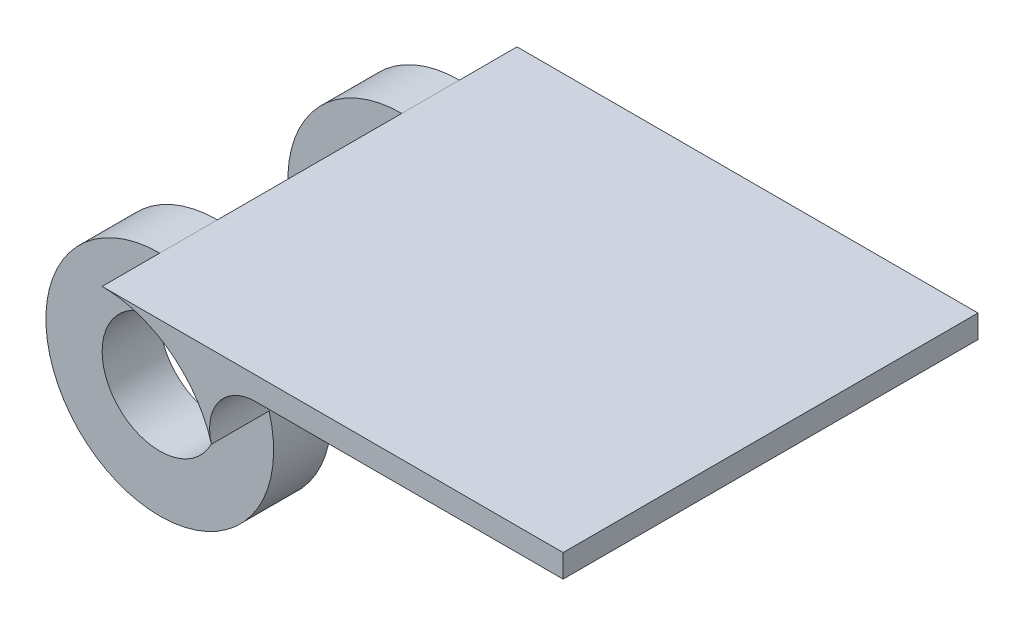
ISO-10303-21;
HEADER;
FILE_DESCRIPTION(('STEP AP214'),'2;1');
FILE_NAME('part.step','',(''),(''),'','','');
FILE_SCHEMA(('AUTOMOTIVE_DESIGN { 1 0 10303 214 1 1 1 1 }'));
ENDSEC;
DATA;
#1=APPLICATION_CONTEXT('core data for automotive mechanical design processes');
#2=APPLICATION_PROTOCOL_DEFINITION('international standard','automotive_design',2000,#1);
#3=PRODUCT_CONTEXT('',#1,'mechanical');
#4=PRODUCT('Part','Part','',(#3));
#5=PRODUCT_RELATED_PRODUCT_CATEGORY('part','',(#4));
#6=PRODUCT_DEFINITION_FORMATION('','',#4);
#7=PRODUCT_DEFINITION_CONTEXT('part definition',#1,'design');
#8=PRODUCT_DEFINITION('design','',#6,#7);
#9=PRODUCT_DEFINITION_SHAPE('','',#8);
#10=(LENGTH_UNIT() NAMED_UNIT(*) SI_UNIT(.MILLI.,.METRE.));
#11=(NAMED_UNIT(*) PLANE_ANGLE_UNIT() SI_UNIT($,.RADIAN.));
#12=(NAMED_UNIT(*) SI_UNIT($,.STERADIAN.) SOLID_ANGLE_UNIT());
#13=UNCERTAINTY_MEASURE_WITH_UNIT(LENGTH_MEASURE(1.E-05),#10,'distance_accuracy_value','');
#14=(GEOMETRIC_REPRESENTATION_CONTEXT(3) GLOBAL_UNCERTAINTY_ASSIGNED_CONTEXT((#13)) GLOBAL_UNIT_ASSIGNED_CONTEXT((#10,
#11,#12)) REPRESENTATION_CONTEXT('',''));
#15=CARTESIAN_POINT('',(0.,0.,0.));
#16=DIRECTION('',(0.,0.,1.));
#17=DIRECTION('',(1.,0.,0.));
#18=AXIS2_PLACEMENT_3D('',#15,#16,#17);
#19=CARTESIAN_POINT('',(0.,0.,22.86));
#20=DIRECTION('',(0.,0.,-1.));
#21=DIRECTION('',(-1.,0.,0.));
#22=AXIS2_PLACEMENT_3D('',#19,#20,#21);
#23=CYLINDRICAL_SURFACE('',#22,6.2738);
#24=CARTESIAN_POINT('',(0.,0.,16.51));
#25=DIRECTION('',(0.,0.,-1.));
#26=DIRECTION('',(-1.,0.,0.));
#27=AXIS2_PLACEMENT_3D('',#24,#25,#26);
#28=CIRCLE('',#27,6.2738);
#29=CARTESIAN_POINT('',(6.02369098499774,1.7537711815562,16.51));
#30=VERTEX_POINT('',#29);
#31=CARTESIAN_POINT('',(0.,6.2738,16.51));
#32=VERTEX_POINT('',#31);
#33=EDGE_CURVE('E124',#30,#32,#28,.T.);
#34=ORIENTED_EDGE('',*,*,#33,.F.);
#35=DIRECTION('',(0.,0.,-1.));
#36=VECTOR('',#35,1.);
#37=CARTESIAN_POINT('',(6.02369098499774,1.7537711815562,22.86));
#38=LINE('',#37,#36);
#39=CARTESIAN_POINT('',(6.02369098499774,1.7537711815562,19.685));
#40=VERTEX_POINT('',#39);
#41=EDGE_CURVE('E58',#30,#40,#38,.F.);
#42=ORIENTED_EDGE('',*,*,#41,.T.);
#43=CARTESIAN_POINT('',(0.,0.,19.685));
#44=DIRECTION('',(0.,0.,1.));
#45=DIRECTION('',(1.,0.,0.));
#46=AXIS2_PLACEMENT_3D('',#43,#44,#45);
#47=CIRCLE('',#46,6.2738);
#48=CARTESIAN_POINT('',(0.,6.2738,19.685));
#49=VERTEX_POINT('',#48);
#50=EDGE_CURVE('E159',#49,#40,#47,.T.);
#51=ORIENTED_EDGE('',*,*,#50,.F.);
#52=DIRECTION('',(0.,0.,1.));
#53=VECTOR('',#52,1.);
#54=CARTESIAN_POINT('',(0.,6.2738,22.86));
#55=LINE('',#54,#53);
#56=EDGE_CURVE('E175',#32,#49,#55,.T.);
#57=ORIENTED_EDGE('',*,*,#56,.F.);
#58=EDGE_LOOP('',(#34,#42,#51,#57));
#59=FACE_BOUND('',#58,.T.);
#60=ADVANCED_FACE('F35',(#59),#23,.T.);
#61=CARTESIAN_POINT('',(0.,0.,22.86));
#62=DIRECTION('',(0.,0.,-1.));
#63=DIRECTION('',(-1.,0.,0.));
#64=AXIS2_PLACEMENT_3D('',#61,#62,#63);
#65=CYLINDRICAL_SURFACE('',#64,3.175);
#66=CARTESIAN_POINT('',(0.,0.,19.685));
#67=DIRECTION('',(0.,0.,1.));
#68=DIRECTION('',(1.,0.,0.));
#69=AXIS2_PLACEMENT_3D('',#66,#67,#68);
#70=CIRCLE('',#69,3.175);
#71=CARTESIAN_POINT('',(3.175,0.,19.685));
#72=VERTEX_POINT('',#71);
#73=EDGE_CURVE('E158',#72,#72,#70,.T.);
#74=ORIENTED_EDGE('',*,*,#73,.T.);
#75=EDGE_LOOP('',(#74));
#76=FACE_BOUND('',#75,.T.);
#77=CARTESIAN_POINT('',(0.,0.,16.51));
#78=DIRECTION('',(0.,0.,-1.));
#79=DIRECTION('',(-1.,0.,0.));
#80=AXIS2_PLACEMENT_3D('',#77,#78,#79);
#81=CIRCLE('',#80,3.175);
#82=CARTESIAN_POINT('',(-3.175,0.,16.51));
#83=VERTEX_POINT('',#82);
#84=EDGE_CURVE('E151',#83,#83,#81,.T.);
#85=ORIENTED_EDGE('',*,*,#84,.T.);
#86=EDGE_LOOP('',(#85));
#87=FACE_BOUND('',#86,.T.);
#88=ADVANCED_FACE('F234',(#76,#87),#65,.F.);
#89=CARTESIAN_POINT('',(8.4624322744705,2.4638,22.86));
#90=DIRECTION('',(0.,0.,-1.));
#91=DIRECTION('',(-1.,0.,0.));
#92=AXIS2_PLACEMENT_3D('',#89,#90,#91);
#93=CYLINDRICAL_SURFACE('',#92,2.54);
#94=CARTESIAN_POINT('',(8.4624322744705,2.4638,16.51));
#95=DIRECTION('',(0.,0.,-1.));
#96=DIRECTION('',(-1.,0.,0.));
#97=AXIS2_PLACEMENT_3D('',#94,#95,#96);
#98=CIRCLE('',#97,2.54);
#99=CARTESIAN_POINT('',(8.4624322744705,5.0038,16.51));
#100=VERTEX_POINT('',#99);
#101=EDGE_CURVE('E11',#100,#30,#98,.F.);
#102=ORIENTED_EDGE('',*,*,#101,.F.);
#103=DIRECTION('',(0.,0.,-1.));
#104=VECTOR('',#103,1.);
#105=CARTESIAN_POINT('',(8.4624322744705,5.0038,0.));
#106=LINE('',#105,#104);
#107=CARTESIAN_POINT('',(8.4624322744705,5.0038,22.86));
#108=VERTEX_POINT('',#107);
#109=EDGE_CURVE('E142',#108,#100,#106,.T.);
#110=ORIENTED_EDGE('',*,*,#109,.F.);
#111=CARTESIAN_POINT('',(8.4624322744705,2.4638,22.86));
#112=DIRECTION('',(0.,0.,1.));
#113=DIRECTION('',(1.,0.,0.));
#114=AXIS2_PLACEMENT_3D('',#111,#112,#113);
#115=CIRCLE('',#114,2.54);
#116=CARTESIAN_POINT('',(6.02369098499773,1.7537711815562,22.86));
#117=VERTEX_POINT('',#116);
#118=EDGE_CURVE('E207',#117,#108,#115,.F.);
#119=ORIENTED_EDGE('',*,*,#118,.F.);
#120=EDGE_CURVE('E200',#40,#117,#38,.F.);
#121=ORIENTED_EDGE('',*,*,#120,.F.);
#122=ORIENTED_EDGE('',*,*,#41,.F.);
#123=EDGE_LOOP('',(#102,#110,#119,#121,#122));
#124=FACE_BOUND('',#123,.T.);
#125=ADVANCED_FACE('F232',(#124),#93,.F.);
#126=CARTESIAN_POINT('',(6.02369098499773,1.7537711815562,3.175));
#127=VERTEX_POINT('',#126);
#128=CARTESIAN_POINT('',(6.02369098499774,1.7537711815562,6.35));
#129=VERTEX_POINT('',#128);
#130=EDGE_CURVE('E205',#127,#129,#38,.F.);
#131=ORIENTED_EDGE('',*,*,#130,.T.);
#132=CARTESIAN_POINT('',(0.,0.,6.35));
#133=DIRECTION('',(0.,0.,-1.));
#134=DIRECTION('',(-1.,0.,0.));
#135=AXIS2_PLACEMENT_3D('',#132,#133,#134);
#136=CIRCLE('',#135,6.2738);
#137=CARTESIAN_POINT('',(0.,6.2738,6.35));
#138=VERTEX_POINT('',#137);
#139=EDGE_CURVE('E50',#129,#138,#136,.T.);
#140=ORIENTED_EDGE('',*,*,#139,.T.);
#141=CARTESIAN_POINT('',(0.,6.2738,3.175));
#142=VERTEX_POINT('',#141);
#143=EDGE_CURVE('E190',#142,#138,#55,.T.);
#144=ORIENTED_EDGE('',*,*,#143,.F.);
#145=CARTESIAN_POINT('',(0.,0.,3.175));
#146=DIRECTION('',(0.,0.,-1.));
#147=DIRECTION('',(-1.,0.,0.));
#148=AXIS2_PLACEMENT_3D('',#145,#146,#147);
#149=CIRCLE('',#148,6.2738);
#150=EDGE_CURVE('E171',#127,#142,#149,.T.);
#151=ORIENTED_EDGE('',*,*,#150,.F.);
#152=EDGE_LOOP('',(#131,#140,#144,#151));
#153=FACE_BOUND('',#152,.T.);
#154=ADVANCED_FACE('F219',(#153),#23,.T.);
#155=CARTESIAN_POINT('',(0.,0.,6.35));
#156=DIRECTION('',(0.,0.,-1.));
#157=DIRECTION('',(-1.,0.,0.));
#158=AXIS2_PLACEMENT_3D('',#155,#156,#157);
#159=CIRCLE('',#158,3.175);
#160=CARTESIAN_POINT('',(-3.175,0.,6.35));
#161=VERTEX_POINT('',#160);
#162=EDGE_CURVE('E148',#161,#161,#159,.T.);
#163=ORIENTED_EDGE('',*,*,#162,.F.);
#164=EDGE_LOOP('',(#163));
#165=FACE_BOUND('',#164,.T.);
#166=CARTESIAN_POINT('',(0.,0.,3.175));
#167=DIRECTION('',(0.,0.,-1.));
#168=DIRECTION('',(-1.,0.,0.));
#169=AXIS2_PLACEMENT_3D('',#166,#167,#168);
#170=CIRCLE('',#169,3.175);
#171=CARTESIAN_POINT('',(-3.175,0.,3.175));
#172=VERTEX_POINT('',#171);
#173=EDGE_CURVE('E170',#172,#172,#170,.T.);
#174=ORIENTED_EDGE('',*,*,#173,.T.);
#175=EDGE_LOOP('',(#174));
#176=FACE_BOUND('',#175,.T.);
#177=ADVANCED_FACE('F239',(#165,#176),#65,.F.);
#178=CARTESIAN_POINT('',(0.,0.,22.86));
#179=DIRECTION('',(0.,0.,1.));
#180=DIRECTION('',(1.,0.,0.));
#181=AXIS2_PLACEMENT_3D('',#178,#179,#180);
#182=PLANE('',#181);
#183=CARTESIAN_POINT('',(0.,0.,22.86));
#184=DIRECTION('',(0.,0.,1.));
#185=DIRECTION('',(1.,0.,0.));
#186=AXIS2_PLACEMENT_3D('',#183,#184,#185);
#187=CIRCLE('',#186,6.2738);
#188=CARTESIAN_POINT('',(0.,6.2738,22.86));
#189=VERTEX_POINT('',#188);
#190=EDGE_CURVE('E154',#117,#189,#187,.T.);
#191=ORIENTED_EDGE('',*,*,#190,.F.);
#192=ORIENTED_EDGE('',*,*,#118,.T.);
#193=DIRECTION('',(1.,0.,0.));
#194=VECTOR('',#193,1.);
#195=CARTESIAN_POINT('',(0.,5.0038,22.86));
#196=LINE('',#195,#194);
#197=CARTESIAN_POINT('',(25.4,5.0038,22.86));
#198=VERTEX_POINT('',#197);
#199=EDGE_CURVE('E176',#108,#198,#196,.T.);
#200=ORIENTED_EDGE('',*,*,#199,.T.);
#201=DIRECTION('',(0.,1.,0.));
#202=VECTOR('',#201,1.);
#203=CARTESIAN_POINT('',(25.4,5.0038,22.86));
#204=LINE('',#203,#202);
#205=CARTESIAN_POINT('',(25.4,6.2738,22.86));
#206=VERTEX_POINT('',#205);
#207=EDGE_CURVE('E185',#198,#206,#204,.T.);
#208=ORIENTED_EDGE('',*,*,#207,.T.);
#209=DIRECTION('',(1.,0.,0.));
#210=VECTOR('',#209,1.);
#211=CARTESIAN_POINT('',(0.,6.2738,22.86));
#212=LINE('',#211,#210);
#213=EDGE_CURVE('E189',#189,#206,#212,.T.);
#214=ORIENTED_EDGE('',*,*,#213,.F.);
#215=EDGE_LOOP('',(#191,#192,#200,#208,#214));
#216=FACE_BOUND('',#215,.T.);
#217=ADVANCED_FACE('F231',(#216),#182,.T.);
#218=CARTESIAN_POINT('',(0.,0.,0.));
#219=DIRECTION('',(0.,0.,1.));
#220=DIRECTION('',(1.,0.,0.));
#221=AXIS2_PLACEMENT_3D('',#218,#219,#220);
#222=PLANE('',#221);
#223=CARTESIAN_POINT('',(8.4624322744705,2.4638,0.));
#224=DIRECTION('',(0.,0.,1.));
#225=DIRECTION('',(1.,0.,0.));
#226=AXIS2_PLACEMENT_3D('',#223,#224,#225);
#227=CIRCLE('',#226,2.54);
#228=CARTESIAN_POINT('',(8.4624322744705,5.0038,0.));
#229=VERTEX_POINT('',#228);
#230=CARTESIAN_POINT('',(6.02369098499774,1.7537711815562,0.));
#231=VERTEX_POINT('',#230);
#232=EDGE_CURVE('E209',#229,#231,#227,.T.);
#233=ORIENTED_EDGE('',*,*,#232,.T.);
#234=CARTESIAN_POINT('',(0.,0.,0.));
#235=DIRECTION('',(0.,0.,-1.));
#236=DIRECTION('',(-1.,0.,0.));
#237=AXIS2_PLACEMENT_3D('',#234,#235,#236);
#238=CIRCLE('',#237,6.2738);
#239=CARTESIAN_POINT('',(0.,6.2738,0.));
#240=VERTEX_POINT('',#239);
#241=EDGE_CURVE('E166',#240,#231,#238,.T.);
#242=ORIENTED_EDGE('',*,*,#241,.F.);
#243=DIRECTION('',(-1.,0.,0.));
#244=VECTOR('',#243,1.);
#245=CARTESIAN_POINT('',(0.,6.2738,0.));
#246=LINE('',#245,#244);
#247=CARTESIAN_POINT('',(25.4,6.2738,0.));
#248=VERTEX_POINT('',#247);
#249=EDGE_CURVE('E179',#248,#240,#246,.T.);
#250=ORIENTED_EDGE('',*,*,#249,.F.);
#251=DIRECTION('',(0.,1.,0.));
#252=VECTOR('',#251,1.);
#253=CARTESIAN_POINT('',(25.4,5.0038,0.));
#254=LINE('',#253,#252);
#255=CARTESIAN_POINT('',(25.4,5.0038,0.));
#256=VERTEX_POINT('',#255);
#257=EDGE_CURVE('E198',#256,#248,#254,.T.);
#258=ORIENTED_EDGE('',*,*,#257,.F.);
#259=DIRECTION('',(-1.,0.,0.));
#260=VECTOR('',#259,1.);
#261=CARTESIAN_POINT('',(0.,5.0038,0.));
#262=LINE('',#261,#260);
#263=EDGE_CURVE('E182',#256,#229,#262,.T.);
#264=ORIENTED_EDGE('',*,*,#263,.T.);
#265=EDGE_LOOP('',(#233,#242,#250,#258,#264));
#266=FACE_BOUND('',#265,.T.);
#267=ADVANCED_FACE('F249',(#266),#222,.F.);
#268=CARTESIAN_POINT('',(0.,5.0038,0.));
#269=DIRECTION('',(0.,-1.,0.));
#270=DIRECTION('',(0.,0.,-1.));
#271=AXIS2_PLACEMENT_3D('',#268,#269,#270);
#272=PLANE('',#271);
#273=ORIENTED_EDGE('',*,*,#199,.F.);
#274=ORIENTED_EDGE('',*,*,#109,.T.);
#275=DIRECTION('',(1.,0.,0.));
#276=VECTOR('',#275,1.);
#277=CARTESIAN_POINT('',(8.4624322744705,5.0038,16.51));
#278=LINE('',#277,#276);
#279=CARTESIAN_POINT('',(3.78451476414084,5.0038,16.51));
#280=VERTEX_POINT('',#279);
#281=EDGE_CURVE('E122',#280,#100,#278,.T.);
#282=ORIENTED_EDGE('',*,*,#281,.F.);
#283=DIRECTION('',(0.,0.,-1.));
#284=VECTOR('',#283,1.);
#285=CARTESIAN_POINT('',(3.78451476414084,5.0038,16.51));
#286=LINE('',#285,#284);
#287=CARTESIAN_POINT('',(3.78451476414084,5.0038,6.35));
#288=VERTEX_POINT('',#287);
#289=EDGE_CURVE('E131',#280,#288,#286,.T.);
#290=ORIENTED_EDGE('',*,*,#289,.T.);
#291=DIRECTION('',(1.,0.,0.));
#292=VECTOR('',#291,1.);
#293=CARTESIAN_POINT('',(8.4624322744705,5.0038,6.35));
#294=LINE('',#293,#292);
#295=CARTESIAN_POINT('',(8.4624322744705,5.0038,6.35));
#296=VERTEX_POINT('',#295);
#297=EDGE_CURVE('E128',#288,#296,#294,.T.);
#298=ORIENTED_EDGE('',*,*,#297,.T.);
#299=EDGE_CURVE('E204',#296,#229,#106,.T.);
#300=ORIENTED_EDGE('',*,*,#299,.T.);
#301=ORIENTED_EDGE('',*,*,#263,.F.);
#302=DIRECTION('',(0.,0.,-1.));
#303=VECTOR('',#302,1.);
#304=CARTESIAN_POINT('',(25.4,5.0038,22.86));
#305=LINE('',#304,#303);
#306=EDGE_CURVE('E178',#198,#256,#305,.T.);
#307=ORIENTED_EDGE('',*,*,#306,.F.);
#308=EDGE_LOOP('',(#273,#274,#282,#290,#298,#300,#301,#307));
#309=FACE_BOUND('',#308,.T.);
#310=ADVANCED_FACE('F140',(#309),#272,.T.);
#311=CARTESIAN_POINT('',(25.4,5.0038,22.86));
#312=DIRECTION('',(1.,0.,0.));
#313=DIRECTION('',(0.,0.,-1.));
#314=AXIS2_PLACEMENT_3D('',#311,#312,#313);
#315=PLANE('',#314);
#316=DIRECTION('',(0.,0.,-1.));
#317=VECTOR('',#316,1.);
#318=CARTESIAN_POINT('',(25.4,6.2738,22.86));
#319=LINE('',#318,#317);
#320=EDGE_CURVE('E193',#206,#248,#319,.T.);
#321=ORIENTED_EDGE('',*,*,#320,.F.);
#322=ORIENTED_EDGE('',*,*,#207,.F.);
#323=ORIENTED_EDGE('',*,*,#306,.T.);
#324=ORIENTED_EDGE('',*,*,#257,.T.);
#325=EDGE_LOOP('',(#321,#322,#323,#324));
#326=FACE_BOUND('',#325,.T.);
#327=ADVANCED_FACE('F257',(#326),#315,.T.);
#328=CARTESIAN_POINT('',(0.,6.2738,0.));
#329=DIRECTION('',(0.,-1.,0.));
#330=DIRECTION('',(0.,0.,-1.));
#331=AXIS2_PLACEMENT_3D('',#328,#329,#330);
#332=PLANE('',#331);
#333=EDGE_CURVE('E186',#240,#142,#55,.T.);
#334=ORIENTED_EDGE('',*,*,#333,.T.);
#335=ORIENTED_EDGE('',*,*,#143,.T.);
#336=EDGE_CURVE('E422',#138,#32,#55,.T.);
#337=ORIENTED_EDGE('',*,*,#336,.T.);
#338=ORIENTED_EDGE('',*,*,#56,.T.);
#339=DIRECTION('',(0.,0.,1.));
#340=VECTOR('',#339,1.);
#341=CARTESIAN_POINT('',(0.,6.2738,19.685));
#342=LINE('',#341,#340);
#343=EDGE_CURVE('E163',#49,#189,#342,.T.);
#344=ORIENTED_EDGE('',*,*,#343,.T.);
#345=ORIENTED_EDGE('',*,*,#213,.T.);
#346=ORIENTED_EDGE('',*,*,#320,.T.);
#347=ORIENTED_EDGE('',*,*,#249,.T.);
#348=EDGE_LOOP('',(#334,#335,#337,#338,#344,#345,#346,#347));
#349=FACE_BOUND('',#348,.T.);
#350=ADVANCED_FACE('F244',(#349),#332,.F.);
#351=ORIENTED_EDGE('',*,*,#299,.F.);
#352=CARTESIAN_POINT('',(8.4624322744705,2.4638,6.35));
#353=DIRECTION('',(0.,0.,-1.));
#354=DIRECTION('',(-1.,0.,0.));
#355=AXIS2_PLACEMENT_3D('',#352,#353,#354);
#356=CIRCLE('',#355,2.54);
#357=EDGE_CURVE('E43',#296,#129,#356,.F.);
#358=ORIENTED_EDGE('',*,*,#357,.T.);
#359=ORIENTED_EDGE('',*,*,#130,.F.);
#360=EDGE_CURVE('E202',#231,#127,#38,.F.);
#361=ORIENTED_EDGE('',*,*,#360,.F.);
#362=ORIENTED_EDGE('',*,*,#232,.F.);
#363=EDGE_LOOP('',(#351,#358,#359,#361,#362));
#364=FACE_BOUND('',#363,.T.);
#365=ADVANCED_FACE('F37',(#364),#93,.F.);
#366=CARTESIAN_POINT('',(0.,0.,3.175));
#367=DIRECTION('',(0.,0.,-1.));
#368=DIRECTION('',(-1.,0.,0.));
#369=AXIS2_PLACEMENT_3D('',#366,#367,#368);
#370=CYLINDRICAL_SURFACE('',#369,6.2738);
#371=ORIENTED_EDGE('',*,*,#333,.F.);
#372=ORIENTED_EDGE('',*,*,#241,.T.);
#373=ORIENTED_EDGE('',*,*,#360,.T.);
#374=EDGE_CURVE('E167',#142,#127,#149,.T.);
#375=ORIENTED_EDGE('',*,*,#374,.F.);
#376=EDGE_LOOP('',(#371,#372,#373,#375));
#377=FACE_BOUND('',#376,.T.);
#378=ADVANCED_FACE('F243',(#377),#370,.F.);
#379=CARTESIAN_POINT('',(0.,0.,3.175));
#380=DIRECTION('',(0.,0.,-1.));
#381=DIRECTION('',(-1.,0.,0.));
#382=AXIS2_PLACEMENT_3D('',#379,#380,#381);
#383=PLANE('',#382);
#384=ORIENTED_EDGE('',*,*,#173,.F.);
#385=EDGE_LOOP('',(#384));
#386=FACE_BOUND('',#385,.T.);
#387=ORIENTED_EDGE('',*,*,#374,.T.);
#388=ORIENTED_EDGE('',*,*,#150,.T.);
#389=EDGE_LOOP('',(#387,#388));
#390=FACE_BOUND('',#389,.T.);
#391=ADVANCED_FACE('F268',(#386,#390),#383,.T.);
#392=CARTESIAN_POINT('',(0.,0.,19.685));
#393=DIRECTION('',(0.,0.,1.));
#394=DIRECTION('',(1.,0.,0.));
#395=AXIS2_PLACEMENT_3D('',#392,#393,#394);
#396=CYLINDRICAL_SURFACE('',#395,6.2738);
#397=EDGE_CURVE('E155',#40,#49,#47,.T.);
#398=ORIENTED_EDGE('',*,*,#397,.F.);
#399=ORIENTED_EDGE('',*,*,#120,.T.);
#400=ORIENTED_EDGE('',*,*,#190,.T.);
#401=ORIENTED_EDGE('',*,*,#343,.F.);
#402=EDGE_LOOP('',(#398,#399,#400,#401));
#403=FACE_BOUND('',#402,.T.);
#404=ADVANCED_FACE('F224',(#403),#396,.F.);
#405=CARTESIAN_POINT('',(0.,0.,19.685));
#406=DIRECTION('',(0.,0.,1.));
#407=DIRECTION('',(1.,0.,0.));
#408=AXIS2_PLACEMENT_3D('',#405,#406,#407);
#409=PLANE('',#408);
#410=ORIENTED_EDGE('',*,*,#73,.F.);
#411=EDGE_LOOP('',(#410));
#412=FACE_BOUND('',#411,.T.);
#413=ORIENTED_EDGE('',*,*,#397,.T.);
#414=ORIENTED_EDGE('',*,*,#50,.T.);
#415=EDGE_LOOP('',(#413,#414));
#416=FACE_BOUND('',#415,.T.);
#417=ADVANCED_FACE('F275',(#412,#416),#409,.T.);
#418=CARTESIAN_POINT('',(0.,0.,16.51));
#419=DIRECTION('',(0.,0.,-1.));
#420=DIRECTION('',(-1.,0.,0.));
#421=AXIS2_PLACEMENT_3D('',#418,#419,#420);
#422=PLANE('',#421);
#423=ORIENTED_EDGE('',*,*,#84,.F.);
#424=EDGE_LOOP('',(#423));
#425=FACE_BOUND('',#424,.T.);
#426=ORIENTED_EDGE('',*,*,#101,.T.);
#427=ORIENTED_EDGE('',*,*,#33,.T.);
#428=EDGE_CURVE('E118',#32,#280,#28,.T.);
#429=ORIENTED_EDGE('',*,*,#428,.T.);
#430=ORIENTED_EDGE('',*,*,#281,.T.);
#431=EDGE_LOOP('',(#426,#427,#429,#430));
#432=FACE_BOUND('',#431,.T.);
#433=ADVANCED_FACE('F120',(#425,#432),#422,.T.);
#434=CARTESIAN_POINT('',(0.,0.,6.35));
#435=DIRECTION('',(0.,0.,-1.));
#436=DIRECTION('',(-1.,0.,0.));
#437=AXIS2_PLACEMENT_3D('',#434,#435,#436);
#438=PLANE('',#437);
#439=ORIENTED_EDGE('',*,*,#162,.T.);
#440=EDGE_LOOP('',(#439));
#441=FACE_BOUND('',#440,.T.);
#442=ORIENTED_EDGE('',*,*,#357,.F.);
#443=ORIENTED_EDGE('',*,*,#297,.F.);
#444=CARTESIAN_POINT('',(0.,0.,6.35));
#445=DIRECTION('',(0.,0.,-1.));
#446=DIRECTION('',(-1.,0.,0.));
#447=AXIS2_PLACEMENT_3D('',#444,#445,#446);
#448=CIRCLE('',#447,6.2738);
#449=EDGE_CURVE('E133',#138,#288,#448,.T.);
#450=ORIENTED_EDGE('',*,*,#449,.F.);
#451=ORIENTED_EDGE('',*,*,#139,.F.);
#452=EDGE_LOOP('',(#442,#443,#450,#451));
#453=FACE_BOUND('',#452,.T.);
#454=ADVANCED_FACE('F281',(#441,#453),#438,.F.);
#455=CARTESIAN_POINT('',(0.,0.,16.51));
#456=DIRECTION('',(0.,0.,-1.));
#457=DIRECTION('',(-1.,0.,0.));
#458=AXIS2_PLACEMENT_3D('',#455,#456,#457);
#459=CYLINDRICAL_SURFACE('',#458,6.2738);
#460=ORIENTED_EDGE('',*,*,#336,.F.);
#461=ORIENTED_EDGE('',*,*,#449,.T.);
#462=ORIENTED_EDGE('',*,*,#289,.F.);
#463=ORIENTED_EDGE('',*,*,#428,.F.);
#464=EDGE_LOOP('',(#460,#461,#462,#463));
#465=FACE_BOUND('',#464,.T.);
#466=ADVANCED_FACE('F132',(#465),#459,.F.);
#467=CLOSED_SHELL('',(#60,#88,#125,#154,#177,#217,#267,#310,#327,#350,#365,#378,#391,#404,#417,
#433,#454,#466));
#468=MANIFOLD_SOLID_BREP('B2',#467);
#469=ADVANCED_BREP_SHAPE_REPRESENTATION('',(#18,#468),#14);
#470=SHAPE_DEFINITION_REPRESENTATION(#9,#469);
ENDSEC;
END-ISO-10303-21;
